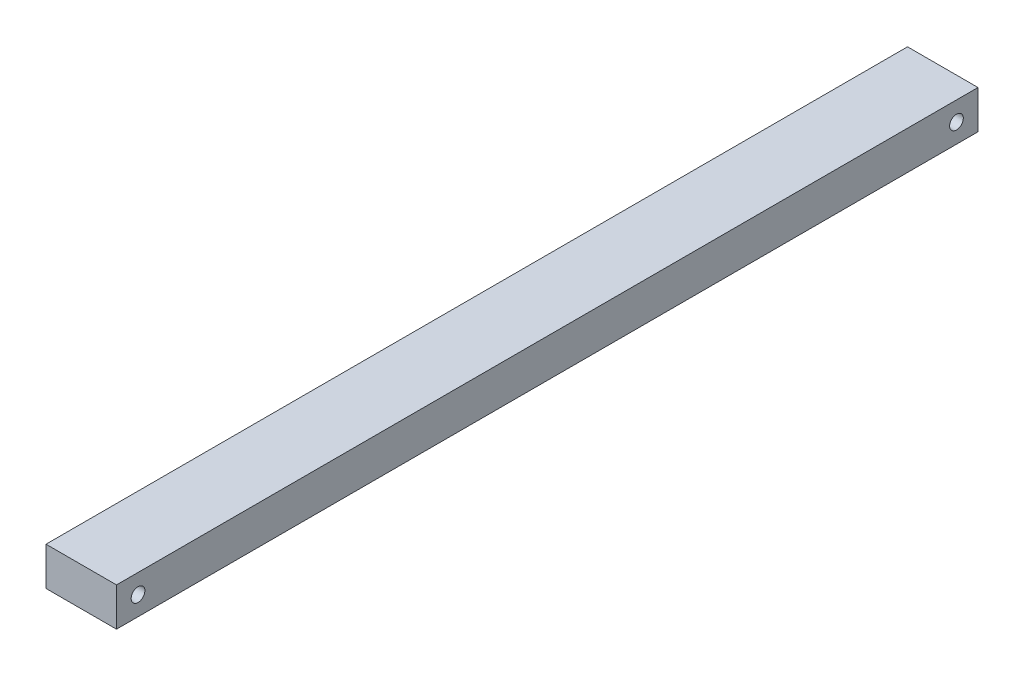
ISO-10303-21;
HEADER;
FILE_DESCRIPTION(('STEP AP214'),'2;1');
FILE_NAME('part.step','',(''),(''),'','','');
FILE_SCHEMA(('AUTOMOTIVE_DESIGN { 1 0 10303 214 1 1 1 1 }'));
ENDSEC;
DATA;
#1=APPLICATION_CONTEXT('core data for automotive mechanical design processes');
#2=APPLICATION_PROTOCOL_DEFINITION('international standard','automotive_design',2000,#1);
#3=PRODUCT_CONTEXT('',#1,'mechanical');
#4=PRODUCT('Part','Part','',(#3));
#5=PRODUCT_RELATED_PRODUCT_CATEGORY('part','',(#4));
#6=PRODUCT_DEFINITION_FORMATION('','',#4);
#7=PRODUCT_DEFINITION_CONTEXT('part definition',#1,'design');
#8=PRODUCT_DEFINITION('design','',#6,#7);
#9=PRODUCT_DEFINITION_SHAPE('','',#8);
#10=(LENGTH_UNIT() NAMED_UNIT(*) SI_UNIT(.MILLI.,.METRE.));
#11=(NAMED_UNIT(*) PLANE_ANGLE_UNIT() SI_UNIT($,.RADIAN.));
#12=(NAMED_UNIT(*) SI_UNIT($,.STERADIAN.) SOLID_ANGLE_UNIT());
#13=UNCERTAINTY_MEASURE_WITH_UNIT(LENGTH_MEASURE(1.E-05),#10,'distance_accuracy_value','');
#14=(GEOMETRIC_REPRESENTATION_CONTEXT(3) GLOBAL_UNCERTAINTY_ASSIGNED_CONTEXT((#13)) GLOBAL_UNIT_ASSIGNED_CONTEXT((#10,
#11,#12)) REPRESENTATION_CONTEXT('',''));
#15=CARTESIAN_POINT('',(0.,0.,0.));
#16=DIRECTION('',(0.,0.,1.));
#17=DIRECTION('',(1.,0.,0.));
#18=AXIS2_PLACEMENT_3D('',#15,#16,#17);
#19=CARTESIAN_POINT('',(26.,4.9,104.5));
#20=DIRECTION('',(-1.,0.,0.));
#21=DIRECTION('',(0.,0.,1.));
#22=AXIS2_PLACEMENT_3D('',#19,#20,#21);
#23=CYLINDRICAL_SURFACE('',#22,1.75);
#24=CARTESIAN_POINT('',(9.00000000000001,4.9,104.5));
#25=DIRECTION('',(-1.,0.,0.));
#26=DIRECTION('',(0.,0.,1.));
#27=AXIS2_PLACEMENT_3D('',#24,#25,#26);
#28=CIRCLE('',#27,1.75);
#29=CARTESIAN_POINT('',(9.00000000000001,4.9,106.25));
#30=VERTEX_POINT('',#29);
#31=EDGE_CURVE('E138',#30,#30,#28,.T.);
#32=ORIENTED_EDGE('',*,*,#31,.F.);
#33=EDGE_LOOP('',(#32));
#34=FACE_BOUND('',#33,.T.);
#35=CARTESIAN_POINT('',(-4.99999999999999,4.9,104.5));
#36=DIRECTION('',(-1.,0.,0.));
#37=DIRECTION('',(0.,0.,1.));
#38=AXIS2_PLACEMENT_3D('',#35,#36,#37);
#39=CIRCLE('',#38,1.75);
#40=CARTESIAN_POINT('',(-4.99999999999999,4.9,106.25));
#41=VERTEX_POINT('',#40);
#42=EDGE_CURVE('E47',#41,#41,#39,.F.);
#43=ORIENTED_EDGE('',*,*,#42,.F.);
#44=EDGE_LOOP('',(#43));
#45=FACE_BOUND('',#44,.T.);
#46=ADVANCED_FACE('F43',(#34,#45),#23,.F.);
#47=CARTESIAN_POINT('',(26.,4.9,-104.5));
#48=DIRECTION('',(-1.,0.,0.));
#49=DIRECTION('',(0.,0.,1.));
#50=AXIS2_PLACEMENT_3D('',#47,#48,#49);
#51=CYLINDRICAL_SURFACE('',#50,1.75);
#52=CARTESIAN_POINT('',(8.99999999999999,4.9,-104.5));
#53=DIRECTION('',(-1.,0.,0.));
#54=DIRECTION('',(0.,0.,1.));
#55=AXIS2_PLACEMENT_3D('',#52,#53,#54);
#56=CIRCLE('',#55,1.75);
#57=CARTESIAN_POINT('',(8.99999999999999,4.9,-102.75));
#58=VERTEX_POINT('',#57);
#59=EDGE_CURVE('E129',#58,#58,#56,.T.);
#60=ORIENTED_EDGE('',*,*,#59,.F.);
#61=EDGE_LOOP('',(#60));
#62=FACE_BOUND('',#61,.T.);
#63=CARTESIAN_POINT('',(-5.00000000000002,4.9,-104.5));
#64=DIRECTION('',(-1.,0.,0.));
#65=DIRECTION('',(0.,0.,1.));
#66=AXIS2_PLACEMENT_3D('',#63,#64,#65);
#67=CIRCLE('',#66,1.75);
#68=CARTESIAN_POINT('',(-5.00000000000002,4.9,-102.75));
#69=VERTEX_POINT('',#68);
#70=EDGE_CURVE('E144',#69,#69,#67,.F.);
#71=ORIENTED_EDGE('',*,*,#70,.F.);
#72=EDGE_LOOP('',(#71));
#73=FACE_BOUND('',#72,.T.);
#74=ADVANCED_FACE('F183',(#62,#73),#51,.F.);
#75=CARTESIAN_POINT('',(-9.00000000000001,9.8,-110.));
#76=DIRECTION('',(1.,0.,0.));
#77=DIRECTION('',(0.,0.,-1.));
#78=AXIS2_PLACEMENT_3D('',#75,#76,#77);
#79=PLANE('',#78);
#80=CARTESIAN_POINT('',(-9.00000000000001,4.9,-104.5));
#81=DIRECTION('',(-1.,0.,0.));
#82=DIRECTION('',(0.,0.,1.));
#83=AXIS2_PLACEMENT_3D('',#80,#81,#82);
#84=CIRCLE('',#83,2.75000000000001);
#85=CARTESIAN_POINT('',(-9.00000000000001,4.9,-101.75));
#86=VERTEX_POINT('',#85);
#87=EDGE_CURVE('E154',#86,#86,#84,.T.);
#88=ORIENTED_EDGE('',*,*,#87,.F.);
#89=EDGE_LOOP('',(#88));
#90=FACE_BOUND('',#89,.T.);
#91=CARTESIAN_POINT('',(-8.99999999999999,4.9,104.5));
#92=DIRECTION('',(-1.,0.,0.));
#93=DIRECTION('',(0.,0.,1.));
#94=AXIS2_PLACEMENT_3D('',#91,#92,#93);
#95=CIRCLE('',#94,2.75000000000001);
#96=CARTESIAN_POINT('',(-8.99999999999999,4.9,107.25));
#97=VERTEX_POINT('',#96);
#98=EDGE_CURVE('E160',#97,#97,#95,.T.);
#99=ORIENTED_EDGE('',*,*,#98,.F.);
#100=EDGE_LOOP('',(#99));
#101=FACE_BOUND('',#100,.T.);
#102=DIRECTION('',(0.,0.,1.));
#103=VECTOR('',#102,1.);
#104=CARTESIAN_POINT('',(-9.00000000000001,0.,-110.));
#105=LINE('',#104,#103);
#106=CARTESIAN_POINT('',(-9.00000000000001,0.,-110.));
#107=VERTEX_POINT('',#106);
#108=CARTESIAN_POINT('',(-8.99999999999999,0.,110.));
#109=VERTEX_POINT('',#108);
#110=EDGE_CURVE('E125',#107,#109,#105,.T.);
#111=ORIENTED_EDGE('',*,*,#110,.T.);
#112=DIRECTION('',(0.,-1.,0.));
#113=VECTOR('',#112,1.);
#114=CARTESIAN_POINT('',(-8.99999999999999,9.8,110.));
#115=LINE('',#114,#113);
#116=CARTESIAN_POINT('',(-8.99999999999999,9.8,110.));
#117=VERTEX_POINT('',#116);
#118=EDGE_CURVE('E11',#117,#109,#115,.T.);
#119=ORIENTED_EDGE('',*,*,#118,.F.);
#120=DIRECTION('',(0.,0.,1.));
#121=VECTOR('',#120,1.);
#122=CARTESIAN_POINT('',(-9.00000000000001,9.8,-110.));
#123=LINE('',#122,#121);
#124=CARTESIAN_POINT('',(-9.00000000000001,9.8,-110.));
#125=VERTEX_POINT('',#124);
#126=EDGE_CURVE('E106',#125,#117,#123,.T.);
#127=ORIENTED_EDGE('',*,*,#126,.F.);
#128=DIRECTION('',(0.,-1.,0.));
#129=VECTOR('',#128,1.);
#130=CARTESIAN_POINT('',(-9.00000000000001,9.8,-110.));
#131=LINE('',#130,#129);
#132=EDGE_CURVE('E121',#125,#107,#131,.T.);
#133=ORIENTED_EDGE('',*,*,#132,.T.);
#134=EDGE_LOOP('',(#111,#119,#127,#133));
#135=FACE_BOUND('',#134,.T.);
#136=ADVANCED_FACE('F45',(#90,#101,#135),#79,.F.);
#137=CARTESIAN_POINT('',(9.00000000000001,9.8,110.));
#138=DIRECTION('',(0.,0.,-1.));
#139=DIRECTION('',(-1.,0.,0.));
#140=AXIS2_PLACEMENT_3D('',#137,#138,#139);
#141=PLANE('',#140);
#142=DIRECTION('',(1.,0.,0.));
#143=VECTOR('',#142,1.);
#144=CARTESIAN_POINT('',(9.00000000000001,0.,110.));
#145=LINE('',#144,#143);
#146=CARTESIAN_POINT('',(9.00000000000001,0.,110.));
#147=VERTEX_POINT('',#146);
#148=EDGE_CURVE('E111',#109,#147,#145,.T.);
#149=ORIENTED_EDGE('',*,*,#148,.T.);
#150=DIRECTION('',(0.,-1.,0.));
#151=VECTOR('',#150,1.);
#152=CARTESIAN_POINT('',(9.00000000000001,9.8,110.));
#153=LINE('',#152,#151);
#154=CARTESIAN_POINT('',(9.00000000000001,9.8,110.));
#155=VERTEX_POINT('',#154);
#156=EDGE_CURVE('E54',#155,#147,#153,.T.);
#157=ORIENTED_EDGE('',*,*,#156,.F.);
#158=DIRECTION('',(1.,0.,0.));
#159=VECTOR('',#158,1.);
#160=CARTESIAN_POINT('',(9.00000000000001,9.8,110.));
#161=LINE('',#160,#159);
#162=EDGE_CURVE('E101',#117,#155,#161,.T.);
#163=ORIENTED_EDGE('',*,*,#162,.F.);
#164=ORIENTED_EDGE('',*,*,#118,.T.);
#165=EDGE_LOOP('',(#149,#157,#163,#164));
#166=FACE_BOUND('',#165,.T.);
#167=ADVANCED_FACE('F110',(#166),#141,.F.);
#168=CARTESIAN_POINT('',(8.99999999999999,9.8,-110.));
#169=DIRECTION('',(-1.,0.,0.));
#170=DIRECTION('',(0.,0.,1.));
#171=AXIS2_PLACEMENT_3D('',#168,#169,#170);
#172=PLANE('',#171);
#173=ORIENTED_EDGE('',*,*,#59,.T.);
#174=EDGE_LOOP('',(#173));
#175=FACE_BOUND('',#174,.T.);
#176=ORIENTED_EDGE('',*,*,#31,.T.);
#177=EDGE_LOOP('',(#176));
#178=FACE_BOUND('',#177,.T.);
#179=DIRECTION('',(0.,0.,-1.));
#180=VECTOR('',#179,1.);
#181=CARTESIAN_POINT('',(8.99999999999999,0.,-110.));
#182=LINE('',#181,#180);
#183=CARTESIAN_POINT('',(8.99999999999999,0.,-110.));
#184=VERTEX_POINT('',#183);
#185=EDGE_CURVE('E87',#147,#184,#182,.T.);
#186=ORIENTED_EDGE('',*,*,#185,.T.);
#187=DIRECTION('',(0.,-1.,0.));
#188=VECTOR('',#187,1.);
#189=CARTESIAN_POINT('',(8.99999999999999,9.8,-110.));
#190=LINE('',#189,#188);
#191=CARTESIAN_POINT('',(8.99999999999999,9.8,-110.));
#192=VERTEX_POINT('',#191);
#193=EDGE_CURVE('E113',#192,#184,#190,.T.);
#194=ORIENTED_EDGE('',*,*,#193,.F.);
#195=DIRECTION('',(0.,0.,-1.));
#196=VECTOR('',#195,1.);
#197=CARTESIAN_POINT('',(8.99999999999999,9.8,-110.));
#198=LINE('',#197,#196);
#199=EDGE_CURVE('E104',#155,#192,#198,.T.);
#200=ORIENTED_EDGE('',*,*,#199,.F.);
#201=ORIENTED_EDGE('',*,*,#156,.T.);
#202=EDGE_LOOP('',(#186,#194,#200,#201));
#203=FACE_BOUND('',#202,.T.);
#204=ADVANCED_FACE('F115',(#175,#178,#203),#172,.F.);
#205=CARTESIAN_POINT('',(8.99999999999999,9.8,-110.));
#206=DIRECTION('',(0.,0.,1.));
#207=DIRECTION('',(1.,0.,0.));
#208=AXIS2_PLACEMENT_3D('',#205,#206,#207);
#209=PLANE('',#208);
#210=DIRECTION('',(-1.,0.,0.));
#211=VECTOR('',#210,1.);
#212=CARTESIAN_POINT('',(8.99999999999999,0.,-110.));
#213=LINE('',#212,#211);
#214=EDGE_CURVE('E93',#184,#107,#213,.T.);
#215=ORIENTED_EDGE('',*,*,#214,.T.);
#216=ORIENTED_EDGE('',*,*,#132,.F.);
#217=DIRECTION('',(-1.,0.,0.));
#218=VECTOR('',#217,1.);
#219=CARTESIAN_POINT('',(8.99999999999999,9.8,-110.));
#220=LINE('',#219,#218);
#221=EDGE_CURVE('E66',#192,#125,#220,.T.);
#222=ORIENTED_EDGE('',*,*,#221,.F.);
#223=ORIENTED_EDGE('',*,*,#193,.T.);
#224=EDGE_LOOP('',(#215,#216,#222,#223));
#225=FACE_BOUND('',#224,.T.);
#226=ADVANCED_FACE('F197',(#225),#209,.F.);
#227=CARTESIAN_POINT('',(0.,9.8,0.));
#228=DIRECTION('',(0.,-1.,0.));
#229=DIRECTION('',(0.,0.,-1.));
#230=AXIS2_PLACEMENT_3D('',#227,#228,#229);
#231=PLANE('',#230);
#232=ORIENTED_EDGE('',*,*,#126,.T.);
#233=ORIENTED_EDGE('',*,*,#162,.T.);
#234=ORIENTED_EDGE('',*,*,#199,.T.);
#235=ORIENTED_EDGE('',*,*,#221,.T.);
#236=EDGE_LOOP('',(#232,#233,#234,#235));
#237=FACE_BOUND('',#236,.T.);
#238=ADVANCED_FACE('F102',(#237),#231,.F.);
#239=CARTESIAN_POINT('',(0.,0.,0.));
#240=DIRECTION('',(0.,-1.,0.));
#241=DIRECTION('',(0.,0.,-1.));
#242=AXIS2_PLACEMENT_3D('',#239,#240,#241);
#243=PLANE('',#242);
#244=ORIENTED_EDGE('',*,*,#110,.F.);
#245=ORIENTED_EDGE('',*,*,#214,.F.);
#246=ORIENTED_EDGE('',*,*,#185,.F.);
#247=ORIENTED_EDGE('',*,*,#148,.F.);
#248=EDGE_LOOP('',(#244,#245,#246,#247));
#249=FACE_BOUND('',#248,.T.);
#250=ADVANCED_FACE('F187',(#249),#243,.T.);
#251=CARTESIAN_POINT('',(-5.00000000000002,4.9,-104.5));
#252=DIRECTION('',(-1.,0.,0.));
#253=DIRECTION('',(0.,0.,1.));
#254=AXIS2_PLACEMENT_3D('',#251,#252,#253);
#255=PLANE('',#254);
#256=CARTESIAN_POINT('',(-5.00000000000002,4.9,-104.5));
#257=DIRECTION('',(-1.,0.,0.));
#258=DIRECTION('',(0.,0.,1.));
#259=AXIS2_PLACEMENT_3D('',#256,#257,#258);
#260=CIRCLE('',#259,2.75000000000001);
#261=CARTESIAN_POINT('',(-5.00000000000002,4.9,-101.75));
#262=VERTEX_POINT('',#261);
#263=EDGE_CURVE('E147',#262,#262,#260,.T.);
#264=ORIENTED_EDGE('',*,*,#263,.T.);
#265=EDGE_LOOP('',(#264));
#266=FACE_BOUND('',#265,.T.);
#267=ORIENTED_EDGE('',*,*,#70,.T.);
#268=EDGE_LOOP('',(#267));
#269=FACE_BOUND('',#268,.T.);
#270=ADVANCED_FACE('F189',(#266,#269),#255,.T.);
#271=CARTESIAN_POINT('',(-5.00000000000002,4.9,-104.5));
#272=DIRECTION('',(-1.,0.,0.));
#273=DIRECTION('',(0.,0.,1.));
#274=AXIS2_PLACEMENT_3D('',#271,#272,#273);
#275=CYLINDRICAL_SURFACE('',#274,2.75000000000001);
#276=ORIENTED_EDGE('',*,*,#263,.F.);
#277=EDGE_LOOP('',(#276));
#278=FACE_BOUND('',#277,.T.);
#279=ORIENTED_EDGE('',*,*,#87,.T.);
#280=EDGE_LOOP('',(#279));
#281=FACE_BOUND('',#280,.T.);
#282=ADVANCED_FACE('F195',(#278,#281),#275,.F.);
#283=CARTESIAN_POINT('',(-4.99999999999999,4.9,104.5));
#284=DIRECTION('',(-1.,0.,0.));
#285=DIRECTION('',(0.,0.,1.));
#286=AXIS2_PLACEMENT_3D('',#283,#284,#285);
#287=PLANE('',#286);
#288=CARTESIAN_POINT('',(-4.99999999999999,4.9,104.5));
#289=DIRECTION('',(-1.,0.,0.));
#290=DIRECTION('',(0.,0.,1.));
#291=AXIS2_PLACEMENT_3D('',#288,#289,#290);
#292=CIRCLE('',#291,2.75000000000001);
#293=CARTESIAN_POINT('',(-4.99999999999999,4.9,107.25));
#294=VERTEX_POINT('',#293);
#295=EDGE_CURVE('E166',#294,#294,#292,.T.);
#296=ORIENTED_EDGE('',*,*,#295,.T.);
#297=EDGE_LOOP('',(#296));
#298=FACE_BOUND('',#297,.T.);
#299=ORIENTED_EDGE('',*,*,#42,.T.);
#300=EDGE_LOOP('',(#299));
#301=FACE_BOUND('',#300,.T.);
#302=ADVANCED_FACE('F172',(#298,#301),#287,.T.);
#303=CARTESIAN_POINT('',(-4.99999999999999,4.9,104.5));
#304=DIRECTION('',(-1.,0.,0.));
#305=DIRECTION('',(0.,0.,1.));
#306=AXIS2_PLACEMENT_3D('',#303,#304,#305);
#307=CYLINDRICAL_SURFACE('',#306,2.75000000000001);
#308=ORIENTED_EDGE('',*,*,#295,.F.);
#309=EDGE_LOOP('',(#308));
#310=FACE_BOUND('',#309,.T.);
#311=ORIENTED_EDGE('',*,*,#98,.T.);
#312=EDGE_LOOP('',(#311));
#313=FACE_BOUND('',#312,.T.);
#314=ADVANCED_FACE('F175',(#310,#313),#307,.F.);
#315=CLOSED_SHELL('',(#46,#74,#136,#167,#204,#226,#238,#250,#270,#282,#302,#314));
#316=MANIFOLD_SOLID_BREP('B2',#315);
#317=ADVANCED_BREP_SHAPE_REPRESENTATION('',(#18,#316),#14);
#318=SHAPE_DEFINITION_REPRESENTATION(#9,#317);
ENDSEC;
END-ISO-10303-21;
